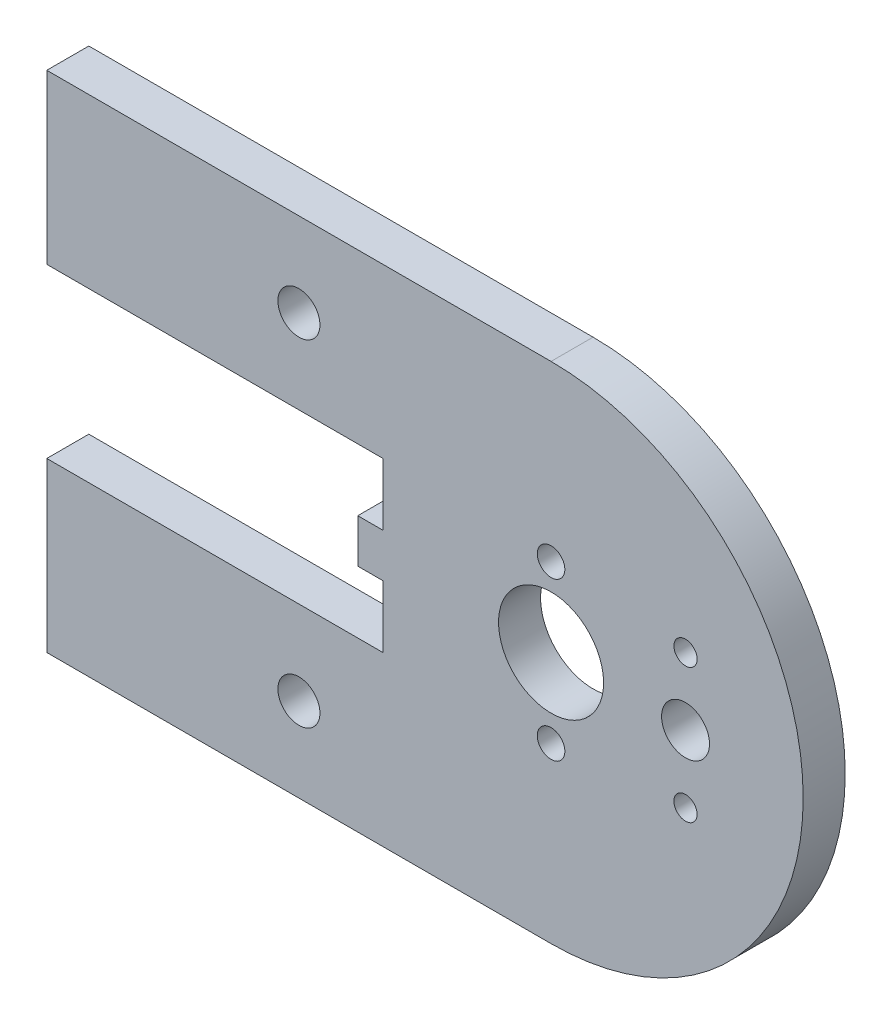
ISO-10303-21;
HEADER;
FILE_DESCRIPTION(('STEP AP214'),'2;1');
FILE_NAME('part.step','',(''),(''),'','','');
FILE_SCHEMA(('AUTOMOTIVE_DESIGN { 1 0 10303 214 1 1 1 1 }'));
ENDSEC;
DATA;
#1=APPLICATION_CONTEXT('core data for automotive mechanical design processes');
#2=APPLICATION_PROTOCOL_DEFINITION('international standard','automotive_design',2000,#1);
#3=PRODUCT_CONTEXT('',#1,'mechanical');
#4=PRODUCT('Part','Part','',(#3));
#5=PRODUCT_RELATED_PRODUCT_CATEGORY('part','',(#4));
#6=PRODUCT_DEFINITION_FORMATION('','',#4);
#7=PRODUCT_DEFINITION_CONTEXT('part definition',#1,'design');
#8=PRODUCT_DEFINITION('design','',#6,#7);
#9=PRODUCT_DEFINITION_SHAPE('','',#8);
#10=(LENGTH_UNIT() NAMED_UNIT(*) SI_UNIT(.MILLI.,.METRE.));
#11=(NAMED_UNIT(*) PLANE_ANGLE_UNIT() SI_UNIT($,.RADIAN.));
#12=(NAMED_UNIT(*) SI_UNIT($,.STERADIAN.) SOLID_ANGLE_UNIT());
#13=UNCERTAINTY_MEASURE_WITH_UNIT(LENGTH_MEASURE(1.E-05),#10,'distance_accuracy_value','');
#14=(GEOMETRIC_REPRESENTATION_CONTEXT(3) GLOBAL_UNCERTAINTY_ASSIGNED_CONTEXT((#13)) GLOBAL_UNIT_ASSIGNED_CONTEXT((#10,
#11,#12)) REPRESENTATION_CONTEXT('',''));
#15=CARTESIAN_POINT('',(0.,0.,0.));
#16=DIRECTION('',(0.,0.,1.));
#17=DIRECTION('',(1.,0.,0.));
#18=AXIS2_PLACEMENT_3D('',#15,#16,#17);
#19=CARTESIAN_POINT('',(12.7,12.7,0.));
#20=DIRECTION('',(1.,0.,0.));
#21=DIRECTION('',(0.,0.,-1.));
#22=AXIS2_PLACEMENT_3D('',#19,#20,#21);
#23=PLANE('',#22);
#24=DIRECTION('',(0.,0.,-1.));
#25=VECTOR('',#24,1.);
#26=CARTESIAN_POINT('',(12.7,3.302,0.));
#27=LINE('',#26,#25);
#28=CARTESIAN_POINT('',(12.7,3.302,6.35));
#29=VERTEX_POINT('',#28);
#30=CARTESIAN_POINT('',(12.7,3.302,0.));
#31=VERTEX_POINT('',#30);
#32=EDGE_CURVE('E332',#29,#31,#27,.T.);
#33=ORIENTED_EDGE('',*,*,#32,.F.);
#34=DIRECTION('',(0.,1.,0.));
#35=VECTOR('',#34,1.);
#36=CARTESIAN_POINT('',(12.7,12.7,6.35));
#37=LINE('',#36,#35);
#38=CARTESIAN_POINT('',(12.7,12.7,6.35));
#39=VERTEX_POINT('',#38);
#40=EDGE_CURVE('E174',#29,#39,#37,.T.);
#41=ORIENTED_EDGE('',*,*,#40,.T.);
#42=DIRECTION('',(0.,0.,1.));
#43=VECTOR('',#42,1.);
#44=CARTESIAN_POINT('',(12.7,12.7,0.));
#45=LINE('',#44,#43);
#46=CARTESIAN_POINT('',(12.7,12.7,0.));
#47=VERTEX_POINT('',#46);
#48=EDGE_CURVE('E234',#47,#39,#45,.T.);
#49=ORIENTED_EDGE('',*,*,#48,.F.);
#50=DIRECTION('',(0.,1.,0.));
#51=VECTOR('',#50,1.);
#52=CARTESIAN_POINT('',(12.7,12.7,0.));
#53=LINE('',#52,#51);
#54=EDGE_CURVE('E58',#31,#47,#53,.T.);
#55=ORIENTED_EDGE('',*,*,#54,.F.);
#56=EDGE_LOOP('',(#33,#41,#49,#55));
#57=FACE_BOUND('',#56,.T.);
#58=ADVANCED_FACE('F38',(#57),#23,.F.);
#59=DIRECTION('',(0.,0.,1.));
#60=VECTOR('',#59,1.);
#61=CARTESIAN_POINT('',(12.7,-3.302,0.));
#62=LINE('',#61,#60);
#63=CARTESIAN_POINT('',(12.7,-3.302,0.));
#64=VERTEX_POINT('',#63);
#65=CARTESIAN_POINT('',(12.7,-3.302,6.35));
#66=VERTEX_POINT('',#65);
#67=EDGE_CURVE('E69',#64,#66,#62,.T.);
#68=ORIENTED_EDGE('',*,*,#67,.F.);
#69=CARTESIAN_POINT('',(12.7,-12.7,0.));
#70=VERTEX_POINT('',#69);
#71=EDGE_CURVE('E223',#70,#64,#53,.T.);
#72=ORIENTED_EDGE('',*,*,#71,.F.);
#73=DIRECTION('',(0.,0.,1.));
#74=VECTOR('',#73,1.);
#75=CARTESIAN_POINT('',(12.7,-12.7,0.));
#76=LINE('',#75,#74);
#77=CARTESIAN_POINT('',(12.7,-12.7,6.35));
#78=VERTEX_POINT('',#77);
#79=EDGE_CURVE('E245',#70,#78,#76,.T.);
#80=ORIENTED_EDGE('',*,*,#79,.T.);
#81=EDGE_CURVE('E235',#78,#66,#37,.T.);
#82=ORIENTED_EDGE('',*,*,#81,.T.);
#83=EDGE_LOOP('',(#68,#72,#80,#82));
#84=FACE_BOUND('',#83,.T.);
#85=ADVANCED_FACE('F326',(#84),#23,.F.);
#86=CARTESIAN_POINT('',(38.1,0.,6.35));
#87=DIRECTION('',(0.,0.,-1.));
#88=DIRECTION('',(-1.,0.,0.));
#89=AXIS2_PLACEMENT_3D('',#86,#87,#88);
#90=PLANE('',#89);
#91=CARTESIAN_POINT('',(58.42,10.1599999999998,6.35));
#92=DIRECTION('',(0.,0.,-1.));
#93=DIRECTION('',(-1.,0.,0.));
#94=AXIS2_PLACEMENT_3D('',#91,#92,#93);
#95=CIRCLE('',#94,1.7526);
#96=CARTESIAN_POINT('',(56.6674,10.1599999999998,6.35));
#97=VERTEX_POINT('',#96);
#98=EDGE_CURVE('E360',#97,#97,#95,.T.);
#99=ORIENTED_EDGE('',*,*,#98,.T.);
#100=EDGE_LOOP('',(#99));
#101=FACE_BOUND('',#100,.T.);
#102=CARTESIAN_POINT('',(58.42,-10.1600000000002,6.35));
#103=DIRECTION('',(0.,0.,-1.));
#104=DIRECTION('',(-1.,0.,0.));
#105=AXIS2_PLACEMENT_3D('',#102,#103,#104);
#106=CIRCLE('',#105,1.7526);
#107=CARTESIAN_POINT('',(56.6674,-10.1600000000002,6.35));
#108=VERTEX_POINT('',#107);
#109=EDGE_CURVE('E349',#108,#108,#106,.T.);
#110=ORIENTED_EDGE('',*,*,#109,.T.);
#111=EDGE_LOOP('',(#110));
#112=FACE_BOUND('',#111,.T.);
#113=CARTESIAN_POINT('',(58.42,0.,6.35));
#114=DIRECTION('',(0.,0.,1.));
#115=DIRECTION('',(1.,0.,0.));
#116=AXIS2_PLACEMENT_3D('',#113,#114,#115);
#117=CIRCLE('',#116,3.6195);
#118=CARTESIAN_POINT('',(62.0395,0.,6.35));
#119=VERTEX_POINT('',#118);
#120=EDGE_CURVE('E336',#119,#119,#117,.T.);
#121=ORIENTED_EDGE('',*,*,#120,.F.);
#122=EDGE_LOOP('',(#121));
#123=FACE_BOUND('',#122,.T.);
#124=CARTESIAN_POINT('',(0.,-25.4,6.35));
#125=DIRECTION('',(0.,0.,1.));
#126=DIRECTION('',(1.,0.,0.));
#127=AXIS2_PLACEMENT_3D('',#124,#125,#126);
#128=CIRCLE('',#127,3.175);
#129=CARTESIAN_POINT('',(3.17500000000001,-25.4,6.35));
#130=VERTEX_POINT('',#129);
#131=EDGE_CURVE('E190',#130,#130,#128,.T.);
#132=ORIENTED_EDGE('',*,*,#131,.F.);
#133=EDGE_LOOP('',(#132));
#134=FACE_BOUND('',#133,.T.);
#135=CARTESIAN_POINT('',(38.1,-11.8999,6.35));
#136=DIRECTION('',(0.,0.,1.));
#137=DIRECTION('',(1.,0.,0.));
#138=AXIS2_PLACEMENT_3D('',#135,#136,#137);
#139=CIRCLE('',#138,2.0828);
#140=CARTESIAN_POINT('',(40.1828,-11.8999,6.35));
#141=VERTEX_POINT('',#140);
#142=EDGE_CURVE('E196',#141,#141,#139,.T.);
#143=ORIENTED_EDGE('',*,*,#142,.F.);
#144=EDGE_LOOP('',(#143));
#145=FACE_BOUND('',#144,.T.);
#146=CARTESIAN_POINT('',(38.1,11.8999,6.35));
#147=DIRECTION('',(0.,0.,1.));
#148=DIRECTION('',(1.,0.,0.));
#149=AXIS2_PLACEMENT_3D('',#146,#147,#148);
#150=CIRCLE('',#149,2.0828);
#151=CARTESIAN_POINT('',(40.1828,11.8999,6.35));
#152=VERTEX_POINT('',#151);
#153=EDGE_CURVE('E204',#152,#152,#150,.T.);
#154=ORIENTED_EDGE('',*,*,#153,.F.);
#155=EDGE_LOOP('',(#154));
#156=FACE_BOUND('',#155,.T.);
#157=CARTESIAN_POINT('',(38.1,0.,6.35));
#158=DIRECTION('',(0.,0.,1.));
#159=DIRECTION('',(1.,0.,0.));
#160=AXIS2_PLACEMENT_3D('',#157,#158,#159);
#161=CIRCLE('',#160,7.9375);
#162=CARTESIAN_POINT('',(46.0375,0.,6.35));
#163=VERTEX_POINT('',#162);
#164=EDGE_CURVE('E212',#163,#163,#161,.T.);
#165=ORIENTED_EDGE('',*,*,#164,.F.);
#166=EDGE_LOOP('',(#165));
#167=FACE_BOUND('',#166,.T.);
#168=ORIENTED_EDGE('',*,*,#81,.F.);
#169=DIRECTION('',(1.,0.,0.));
#170=VECTOR('',#169,1.);
#171=CARTESIAN_POINT('',(-38.1,-12.7,6.35));
#172=LINE('',#171,#170);
#173=CARTESIAN_POINT('',(-38.1,-12.7,6.35));
#174=VERTEX_POINT('',#173);
#175=EDGE_CURVE('E241',#174,#78,#172,.T.);
#176=ORIENTED_EDGE('',*,*,#175,.F.);
#177=DIRECTION('',(0.,1.,0.));
#178=VECTOR('',#177,1.);
#179=CARTESIAN_POINT('',(-38.1,-38.1,6.35));
#180=LINE('',#179,#178);
#181=CARTESIAN_POINT('',(-38.1,-38.1,6.35));
#182=VERTEX_POINT('',#181);
#183=EDGE_CURVE('E257',#182,#174,#180,.T.);
#184=ORIENTED_EDGE('',*,*,#183,.F.);
#185=DIRECTION('',(1.,0.,0.));
#186=VECTOR('',#185,1.);
#187=CARTESIAN_POINT('',(-38.1,-38.1,6.35));
#188=LINE('',#187,#186);
#189=CARTESIAN_POINT('',(38.1,-38.1,6.35));
#190=VERTEX_POINT('',#189);
#191=EDGE_CURVE('E269',#182,#190,#188,.T.);
#192=ORIENTED_EDGE('',*,*,#191,.T.);
#193=CARTESIAN_POINT('',(38.1,0.,6.35));
#194=DIRECTION('',(0.,0.,-1.));
#195=DIRECTION('',(-1.,0.,0.));
#196=AXIS2_PLACEMENT_3D('',#193,#194,#195);
#197=CIRCLE('',#196,38.1);
#198=CARTESIAN_POINT('',(38.1,38.1,6.35));
#199=VERTEX_POINT('',#198);
#200=EDGE_CURVE('E265',#199,#190,#197,.T.);
#201=ORIENTED_EDGE('',*,*,#200,.F.);
#202=DIRECTION('',(1.,0.,0.));
#203=VECTOR('',#202,1.);
#204=CARTESIAN_POINT('',(-38.1,38.1,6.35));
#205=LINE('',#204,#203);
#206=CARTESIAN_POINT('',(-38.1,38.1,6.35));
#207=VERTEX_POINT('',#206);
#208=EDGE_CURVE('E260',#207,#199,#205,.T.);
#209=ORIENTED_EDGE('',*,*,#208,.F.);
#210=CARTESIAN_POINT('',(-38.1,12.7,6.35));
#211=VERTEX_POINT('',#210);
#212=EDGE_CURVE('E261',#211,#207,#180,.T.);
#213=ORIENTED_EDGE('',*,*,#212,.F.);
#214=DIRECTION('',(-1.,0.,0.));
#215=VECTOR('',#214,1.);
#216=CARTESIAN_POINT('',(-38.1,12.7,6.35));
#217=LINE('',#216,#215);
#218=EDGE_CURVE('E238',#39,#211,#217,.T.);
#219=ORIENTED_EDGE('',*,*,#218,.F.);
#220=ORIENTED_EDGE('',*,*,#40,.F.);
#221=DIRECTION('',(1.,0.,0.));
#222=VECTOR('',#221,1.);
#223=CARTESIAN_POINT('',(8.89,3.302,6.35));
#224=LINE('',#223,#222);
#225=CARTESIAN_POINT('',(8.89,3.302,6.35));
#226=VERTEX_POINT('',#225);
#227=EDGE_CURVE('E151',#226,#29,#224,.T.);
#228=ORIENTED_EDGE('',*,*,#227,.F.);
#229=DIRECTION('',(0.,1.,0.));
#230=VECTOR('',#229,1.);
#231=CARTESIAN_POINT('',(8.89,3.302,6.35));
#232=LINE('',#231,#230);
#233=CARTESIAN_POINT('',(8.89,-3.302,6.35));
#234=VERTEX_POINT('',#233);
#235=EDGE_CURVE('E158',#234,#226,#232,.T.);
#236=ORIENTED_EDGE('',*,*,#235,.F.);
#237=DIRECTION('',(1.,0.,0.));
#238=VECTOR('',#237,1.);
#239=CARTESIAN_POINT('',(8.89,-3.302,6.35));
#240=LINE('',#239,#238);
#241=EDGE_CURVE('E325',#234,#66,#240,.T.);
#242=ORIENTED_EDGE('',*,*,#241,.T.);
#243=EDGE_LOOP('',(#168,#176,#184,#192,#201,#209,#213,#219,#220,#228,#236,#242));
#244=FACE_BOUND('',#243,.T.);
#245=CARTESIAN_POINT('',(0.,25.4,6.35));
#246=DIRECTION('',(0.,0.,-1.));
#247=DIRECTION('',(1.,0.,0.));
#248=AXIS2_PLACEMENT_3D('',#245,#246,#247);
#249=CIRCLE('',#248,3.175);
#250=CARTESIAN_POINT('',(3.17500000000001,25.4,6.35));
#251=VERTEX_POINT('',#250);
#252=EDGE_CURVE('E176',#251,#251,#249,.T.);
#253=ORIENTED_EDGE('',*,*,#252,.T.);
#254=EDGE_LOOP('',(#253));
#255=FACE_BOUND('',#254,.T.);
#256=ADVANCED_FACE('F171',(#101,#112,#123,#134,#145,#156,#167,#244,#255),#90,.F.);
#257=CARTESIAN_POINT('',(38.1,0.,0.));
#258=DIRECTION('',(0.,0.,-1.));
#259=DIRECTION('',(-1.,0.,0.));
#260=AXIS2_PLACEMENT_3D('',#257,#258,#259);
#261=PLANE('',#260);
#262=CARTESIAN_POINT('',(58.42,10.1599999999998,0.));
#263=DIRECTION('',(0.,0.,-1.));
#264=DIRECTION('',(-1.,0.,0.));
#265=AXIS2_PLACEMENT_3D('',#262,#263,#264);
#266=CIRCLE('',#265,1.7526);
#267=CARTESIAN_POINT('',(56.6674,10.1599999999998,0.));
#268=VERTEX_POINT('',#267);
#269=EDGE_CURVE('E364',#268,#268,#266,.T.);
#270=ORIENTED_EDGE('',*,*,#269,.F.);
#271=EDGE_LOOP('',(#270));
#272=FACE_BOUND('',#271,.T.);
#273=CARTESIAN_POINT('',(58.42,-10.1600000000002,0.));
#274=DIRECTION('',(0.,0.,-1.));
#275=DIRECTION('',(-1.,0.,0.));
#276=AXIS2_PLACEMENT_3D('',#273,#274,#275);
#277=CIRCLE('',#276,1.7526);
#278=CARTESIAN_POINT('',(56.6674,-10.1600000000002,0.));
#279=VERTEX_POINT('',#278);
#280=EDGE_CURVE('E356',#279,#279,#277,.T.);
#281=ORIENTED_EDGE('',*,*,#280,.F.);
#282=EDGE_LOOP('',(#281));
#283=FACE_BOUND('',#282,.T.);
#284=CARTESIAN_POINT('',(58.42,0.,0.));
#285=DIRECTION('',(0.,0.,-1.));
#286=DIRECTION('',(-1.,0.,0.));
#287=AXIS2_PLACEMENT_3D('',#284,#285,#286);
#288=CIRCLE('',#287,3.6195);
#289=CARTESIAN_POINT('',(54.8005,0.,0.));
#290=VERTEX_POINT('',#289);
#291=EDGE_CURVE('E345',#290,#290,#288,.F.);
#292=ORIENTED_EDGE('',*,*,#291,.T.);
#293=EDGE_LOOP('',(#292));
#294=FACE_BOUND('',#293,.T.);
#295=DIRECTION('',(1.,0.,0.));
#296=VECTOR('',#295,1.);
#297=CARTESIAN_POINT('',(-38.1,-12.7,0.));
#298=LINE('',#297,#296);
#299=CARTESIAN_POINT('',(-38.1,-12.7,0.));
#300=VERTEX_POINT('',#299);
#301=EDGE_CURVE('E230',#300,#70,#298,.T.);
#302=ORIENTED_EDGE('',*,*,#301,.T.);
#303=ORIENTED_EDGE('',*,*,#71,.T.);
#304=DIRECTION('',(1.,0.,0.));
#305=VECTOR('',#304,1.);
#306=CARTESIAN_POINT('',(8.89,-3.302,0.));
#307=LINE('',#306,#305);
#308=CARTESIAN_POINT('',(8.89,-3.302,0.));
#309=VERTEX_POINT('',#308);
#310=EDGE_CURVE('E184',#309,#64,#307,.T.);
#311=ORIENTED_EDGE('',*,*,#310,.F.);
#312=DIRECTION('',(0.,-1.,0.));
#313=VECTOR('',#312,1.);
#314=CARTESIAN_POINT('',(8.89,3.302,0.));
#315=LINE('',#314,#313);
#316=CARTESIAN_POINT('',(8.89,3.302,0.));
#317=VERTEX_POINT('',#316);
#318=EDGE_CURVE('E157',#317,#309,#315,.T.);
#319=ORIENTED_EDGE('',*,*,#318,.F.);
#320=DIRECTION('',(1.,0.,0.));
#321=VECTOR('',#320,1.);
#322=CARTESIAN_POINT('',(8.89,3.302,0.));
#323=LINE('',#322,#321);
#324=EDGE_CURVE('E153',#317,#31,#323,.T.);
#325=ORIENTED_EDGE('',*,*,#324,.T.);
#326=ORIENTED_EDGE('',*,*,#54,.T.);
#327=DIRECTION('',(-1.,0.,0.));
#328=VECTOR('',#327,1.);
#329=CARTESIAN_POINT('',(-38.1,12.7,0.));
#330=LINE('',#329,#328);
#331=CARTESIAN_POINT('',(-38.1,12.7,0.));
#332=VERTEX_POINT('',#331);
#333=EDGE_CURVE('E226',#47,#332,#330,.T.);
#334=ORIENTED_EDGE('',*,*,#333,.T.);
#335=DIRECTION('',(0.,1.,0.));
#336=VECTOR('',#335,1.);
#337=CARTESIAN_POINT('',(-38.1,-38.1,0.));
#338=LINE('',#337,#336);
#339=CARTESIAN_POINT('',(-38.1,38.1,0.));
#340=VERTEX_POINT('',#339);
#341=EDGE_CURVE('E248',#332,#340,#338,.T.);
#342=ORIENTED_EDGE('',*,*,#341,.T.);
#343=DIRECTION('',(1.,0.,0.));
#344=VECTOR('',#343,1.);
#345=CARTESIAN_POINT('',(-38.1,38.1,0.));
#346=LINE('',#345,#344);
#347=CARTESIAN_POINT('',(38.1,38.1,0.));
#348=VERTEX_POINT('',#347);
#349=EDGE_CURVE('E275',#340,#348,#346,.T.);
#350=ORIENTED_EDGE('',*,*,#349,.T.);
#351=CARTESIAN_POINT('',(38.1,0.,0.));
#352=DIRECTION('',(0.,0.,-1.));
#353=DIRECTION('',(-1.,0.,0.));
#354=AXIS2_PLACEMENT_3D('',#351,#352,#353);
#355=CIRCLE('',#354,38.1);
#356=CARTESIAN_POINT('',(38.1,-38.1,0.));
#357=VERTEX_POINT('',#356);
#358=EDGE_CURVE('E279',#348,#357,#355,.T.);
#359=ORIENTED_EDGE('',*,*,#358,.T.);
#360=DIRECTION('',(1.,0.,0.));
#361=VECTOR('',#360,1.);
#362=CARTESIAN_POINT('',(-38.1,-38.1,0.));
#363=LINE('',#362,#361);
#364=CARTESIAN_POINT('',(-38.1,-38.1,0.));
#365=VERTEX_POINT('',#364);
#366=EDGE_CURVE('E283',#365,#357,#363,.T.);
#367=ORIENTED_EDGE('',*,*,#366,.F.);
#368=EDGE_CURVE('E272',#365,#300,#338,.T.);
#369=ORIENTED_EDGE('',*,*,#368,.T.);
#370=EDGE_LOOP('',(#302,#303,#311,#319,#325,#326,#334,#342,#350,#359,#367,#369));
#371=FACE_BOUND('',#370,.T.);
#372=CARTESIAN_POINT('',(38.1,0.,0.));
#373=DIRECTION('',(0.,0.,1.));
#374=DIRECTION('',(1.,0.,0.));
#375=AXIS2_PLACEMENT_3D('',#372,#373,#374);
#376=CIRCLE('',#375,7.9375);
#377=CARTESIAN_POINT('',(46.0375,0.,0.));
#378=VERTEX_POINT('',#377);
#379=EDGE_CURVE('E216',#378,#378,#376,.T.);
#380=ORIENTED_EDGE('',*,*,#379,.T.);
#381=EDGE_LOOP('',(#380));
#382=FACE_BOUND('',#381,.T.);
#383=CARTESIAN_POINT('',(38.1,11.8999,0.));
#384=DIRECTION('',(0.,0.,1.));
#385=DIRECTION('',(1.,0.,0.));
#386=AXIS2_PLACEMENT_3D('',#383,#384,#385);
#387=CIRCLE('',#386,2.0828);
#388=CARTESIAN_POINT('',(40.1828,11.8999,0.));
#389=VERTEX_POINT('',#388);
#390=EDGE_CURVE('E208',#389,#389,#387,.T.);
#391=ORIENTED_EDGE('',*,*,#390,.T.);
#392=EDGE_LOOP('',(#391));
#393=FACE_BOUND('',#392,.T.);
#394=CARTESIAN_POINT('',(38.1,-11.8999,0.));
#395=DIRECTION('',(0.,0.,1.));
#396=DIRECTION('',(1.,0.,0.));
#397=AXIS2_PLACEMENT_3D('',#394,#395,#396);
#398=CIRCLE('',#397,2.0828);
#399=CARTESIAN_POINT('',(40.1828,-11.8999,0.));
#400=VERTEX_POINT('',#399);
#401=EDGE_CURVE('E200',#400,#400,#398,.T.);
#402=ORIENTED_EDGE('',*,*,#401,.T.);
#403=EDGE_LOOP('',(#402));
#404=FACE_BOUND('',#403,.T.);
#405=CARTESIAN_POINT('',(0.,-25.4,0.));
#406=DIRECTION('',(0.,0.,1.));
#407=DIRECTION('',(1.,0.,0.));
#408=AXIS2_PLACEMENT_3D('',#405,#406,#407);
#409=CIRCLE('',#408,3.175);
#410=CARTESIAN_POINT('',(3.17500000000001,-25.4,0.));
#411=VERTEX_POINT('',#410);
#412=EDGE_CURVE('E192',#411,#411,#409,.T.);
#413=ORIENTED_EDGE('',*,*,#412,.T.);
#414=EDGE_LOOP('',(#413));
#415=FACE_BOUND('',#414,.T.);
#416=CARTESIAN_POINT('',(0.,25.4,0.));
#417=DIRECTION('',(0.,0.,-1.));
#418=DIRECTION('',(1.,0.,0.));
#419=AXIS2_PLACEMENT_3D('',#416,#417,#418);
#420=CIRCLE('',#419,3.175);
#421=CARTESIAN_POINT('',(3.17500000000001,25.4,0.));
#422=VERTEX_POINT('',#421);
#423=EDGE_CURVE('E181',#422,#422,#420,.T.);
#424=ORIENTED_EDGE('',*,*,#423,.F.);
#425=EDGE_LOOP('',(#424));
#426=FACE_BOUND('',#425,.T.);
#427=ADVANCED_FACE('F303',(#272,#283,#294,#371,#382,#393,#404,#415,#426),#261,.T.);
#428=CARTESIAN_POINT('',(-38.1,-38.1,6.35));
#429=DIRECTION('',(-1.,0.,0.));
#430=DIRECTION('',(0.,0.,1.));
#431=AXIS2_PLACEMENT_3D('',#428,#429,#430);
#432=PLANE('',#431);
#433=DIRECTION('',(0.,0.,1.));
#434=VECTOR('',#433,1.);
#435=CARTESIAN_POINT('',(-38.1,-12.7,0.));
#436=LINE('',#435,#434);
#437=EDGE_CURVE('E249',#300,#174,#436,.T.);
#438=ORIENTED_EDGE('',*,*,#437,.F.);
#439=ORIENTED_EDGE('',*,*,#368,.F.);
#440=DIRECTION('',(0.,0.,-1.));
#441=VECTOR('',#440,1.);
#442=CARTESIAN_POINT('',(-38.1,-38.1,6.35));
#443=LINE('',#442,#441);
#444=EDGE_CURVE('E11',#182,#365,#443,.T.);
#445=ORIENTED_EDGE('',*,*,#444,.F.);
#446=ORIENTED_EDGE('',*,*,#183,.T.);
#447=EDGE_LOOP('',(#438,#439,#445,#446));
#448=FACE_BOUND('',#447,.T.);
#449=ADVANCED_FACE('F321',(#448),#432,.T.);
#450=DIRECTION('',(0.,0.,1.));
#451=VECTOR('',#450,1.);
#452=CARTESIAN_POINT('',(-38.1,12.7,0.));
#453=LINE('',#452,#451);
#454=EDGE_CURVE('E251',#332,#211,#453,.T.);
#455=ORIENTED_EDGE('',*,*,#454,.T.);
#456=ORIENTED_EDGE('',*,*,#212,.T.);
#457=DIRECTION('',(0.,0.,-1.));
#458=VECTOR('',#457,1.);
#459=CARTESIAN_POINT('',(-38.1,38.1,6.35));
#460=LINE('',#459,#458);
#461=EDGE_CURVE('E42',#207,#340,#460,.T.);
#462=ORIENTED_EDGE('',*,*,#461,.T.);
#463=ORIENTED_EDGE('',*,*,#341,.F.);
#464=EDGE_LOOP('',(#455,#456,#462,#463));
#465=FACE_BOUND('',#464,.T.);
#466=ADVANCED_FACE('F40',(#465),#432,.T.);
#467=CARTESIAN_POINT('',(-38.1,-38.1,6.35));
#468=DIRECTION('',(0.,1.,0.));
#469=DIRECTION('',(0.,0.,1.));
#470=AXIS2_PLACEMENT_3D('',#467,#468,#469);
#471=PLANE('',#470);
#472=ORIENTED_EDGE('',*,*,#366,.T.);
#473=DIRECTION('',(0.,0.,-1.));
#474=VECTOR('',#473,1.);
#475=CARTESIAN_POINT('',(38.1,-38.1,6.35));
#476=LINE('',#475,#474);
#477=EDGE_CURVE('E47',#190,#357,#476,.T.);
#478=ORIENTED_EDGE('',*,*,#477,.F.);
#479=ORIENTED_EDGE('',*,*,#191,.F.);
#480=ORIENTED_EDGE('',*,*,#444,.T.);
#481=EDGE_LOOP('',(#472,#478,#479,#480));
#482=FACE_BOUND('',#481,.T.);
#483=ADVANCED_FACE('F317',(#482),#471,.F.);
#484=CARTESIAN_POINT('',(38.1,0.,6.35));
#485=DIRECTION('',(0.,0.,-1.));
#486=DIRECTION('',(-1.,0.,0.));
#487=AXIS2_PLACEMENT_3D('',#484,#485,#486);
#488=CYLINDRICAL_SURFACE('',#487,38.1);
#489=ORIENTED_EDGE('',*,*,#358,.F.);
#490=DIRECTION('',(0.,0.,-1.));
#491=VECTOR('',#490,1.);
#492=CARTESIAN_POINT('',(38.1,38.1,6.35));
#493=LINE('',#492,#491);
#494=EDGE_CURVE('E288',#199,#348,#493,.T.);
#495=ORIENTED_EDGE('',*,*,#494,.F.);
#496=ORIENTED_EDGE('',*,*,#200,.T.);
#497=ORIENTED_EDGE('',*,*,#477,.T.);
#498=EDGE_LOOP('',(#489,#495,#496,#497));
#499=FACE_BOUND('',#498,.T.);
#500=ADVANCED_FACE('F315',(#499),#488,.T.);
#501=CARTESIAN_POINT('',(-38.1,38.1,6.35));
#502=DIRECTION('',(0.,1.,0.));
#503=DIRECTION('',(0.,0.,1.));
#504=AXIS2_PLACEMENT_3D('',#501,#502,#503);
#505=PLANE('',#504);
#506=ORIENTED_EDGE('',*,*,#349,.F.);
#507=ORIENTED_EDGE('',*,*,#461,.F.);
#508=ORIENTED_EDGE('',*,*,#208,.T.);
#509=ORIENTED_EDGE('',*,*,#494,.T.);
#510=EDGE_LOOP('',(#506,#507,#508,#509));
#511=FACE_BOUND('',#510,.T.);
#512=ADVANCED_FACE('F301',(#511),#505,.T.);
#513=CARTESIAN_POINT('',(-38.1,-12.7,0.));
#514=DIRECTION('',(0.,-1.,0.));
#515=DIRECTION('',(0.,0.,-1.));
#516=AXIS2_PLACEMENT_3D('',#513,#514,#515);
#517=PLANE('',#516);
#518=ORIENTED_EDGE('',*,*,#175,.T.);
#519=ORIENTED_EDGE('',*,*,#79,.F.);
#520=ORIENTED_EDGE('',*,*,#301,.F.);
#521=ORIENTED_EDGE('',*,*,#437,.T.);
#522=EDGE_LOOP('',(#518,#519,#520,#521));
#523=FACE_BOUND('',#522,.T.);
#524=ADVANCED_FACE('F324',(#523),#517,.F.);
#525=CARTESIAN_POINT('',(-38.1,12.7,0.));
#526=DIRECTION('',(0.,1.,0.));
#527=DIRECTION('',(0.,0.,1.));
#528=AXIS2_PLACEMENT_3D('',#525,#526,#527);
#529=PLANE('',#528);
#530=ORIENTED_EDGE('',*,*,#218,.T.);
#531=ORIENTED_EDGE('',*,*,#454,.F.);
#532=ORIENTED_EDGE('',*,*,#333,.F.);
#533=ORIENTED_EDGE('',*,*,#48,.T.);
#534=EDGE_LOOP('',(#530,#531,#532,#533));
#535=FACE_BOUND('',#534,.T.);
#536=ADVANCED_FACE('F309',(#535),#529,.F.);
#537=CARTESIAN_POINT('',(38.1,0.,0.));
#538=DIRECTION('',(0.,0.,1.));
#539=DIRECTION('',(1.,0.,0.));
#540=AXIS2_PLACEMENT_3D('',#537,#538,#539);
#541=CYLINDRICAL_SURFACE('',#540,7.9375);
#542=ORIENTED_EDGE('',*,*,#379,.F.);
#543=EDGE_LOOP('',(#542));
#544=FACE_BOUND('',#543,.T.);
#545=ORIENTED_EDGE('',*,*,#164,.T.);
#546=EDGE_LOOP('',(#545));
#547=FACE_BOUND('',#546,.T.);
#548=ADVANCED_FACE('F397',(#544,#547),#541,.F.);
#549=CARTESIAN_POINT('',(38.1,11.8999,0.));
#550=DIRECTION('',(0.,0.,1.));
#551=DIRECTION('',(1.,0.,0.));
#552=AXIS2_PLACEMENT_3D('',#549,#550,#551);
#553=CYLINDRICAL_SURFACE('',#552,2.0828);
#554=ORIENTED_EDGE('',*,*,#390,.F.);
#555=EDGE_LOOP('',(#554));
#556=FACE_BOUND('',#555,.T.);
#557=ORIENTED_EDGE('',*,*,#153,.T.);
#558=EDGE_LOOP('',(#557));
#559=FACE_BOUND('',#558,.T.);
#560=ADVANCED_FACE('F399',(#556,#559),#553,.F.);
#561=CARTESIAN_POINT('',(38.1,-11.8999,0.));
#562=DIRECTION('',(0.,0.,1.));
#563=DIRECTION('',(1.,0.,0.));
#564=AXIS2_PLACEMENT_3D('',#561,#562,#563);
#565=CYLINDRICAL_SURFACE('',#564,2.0828);
#566=ORIENTED_EDGE('',*,*,#401,.F.);
#567=EDGE_LOOP('',(#566));
#568=FACE_BOUND('',#567,.T.);
#569=ORIENTED_EDGE('',*,*,#142,.T.);
#570=EDGE_LOOP('',(#569));
#571=FACE_BOUND('',#570,.T.);
#572=ADVANCED_FACE('F406',(#568,#571),#565,.F.);
#573=CARTESIAN_POINT('',(0.,-25.4,0.));
#574=DIRECTION('',(0.,0.,1.));
#575=DIRECTION('',(1.,0.,0.));
#576=AXIS2_PLACEMENT_3D('',#573,#574,#575);
#577=CYLINDRICAL_SURFACE('',#576,3.175);
#578=ORIENTED_EDGE('',*,*,#412,.F.);
#579=EDGE_LOOP('',(#578));
#580=FACE_BOUND('',#579,.T.);
#581=ORIENTED_EDGE('',*,*,#131,.T.);
#582=EDGE_LOOP('',(#581));
#583=FACE_BOUND('',#582,.T.);
#584=ADVANCED_FACE('F453',(#580,#583),#577,.F.);
#585=CARTESIAN_POINT('',(0.,25.4,0.));
#586=DIRECTION('',(0.,0.,1.));
#587=DIRECTION('',(1.,0.,0.));
#588=AXIS2_PLACEMENT_3D('',#585,#586,#587);
#589=CYLINDRICAL_SURFACE('',#588,3.175);
#590=ORIENTED_EDGE('',*,*,#423,.T.);
#591=EDGE_LOOP('',(#590));
#592=FACE_BOUND('',#591,.T.);
#593=ORIENTED_EDGE('',*,*,#252,.F.);
#594=EDGE_LOOP('',(#593));
#595=FACE_BOUND('',#594,.T.);
#596=ADVANCED_FACE('F463',(#592,#595),#589,.F.);
#597=CARTESIAN_POINT('',(8.89,3.302,0.));
#598=DIRECTION('',(0.,-1.,0.));
#599=DIRECTION('',(0.,0.,-1.));
#600=AXIS2_PLACEMENT_3D('',#597,#598,#599);
#601=PLANE('',#600);
#602=ORIENTED_EDGE('',*,*,#32,.T.);
#603=ORIENTED_EDGE('',*,*,#324,.F.);
#604=DIRECTION('',(0.,0.,-1.));
#605=VECTOR('',#604,1.);
#606=CARTESIAN_POINT('',(8.89,3.302,0.));
#607=LINE('',#606,#605);
#608=EDGE_CURVE('E147',#226,#317,#607,.T.);
#609=ORIENTED_EDGE('',*,*,#608,.F.);
#610=ORIENTED_EDGE('',*,*,#227,.T.);
#611=EDGE_LOOP('',(#602,#603,#609,#610));
#612=FACE_BOUND('',#611,.T.);
#613=ADVANCED_FACE('F149',(#612),#601,.F.);
#614=CARTESIAN_POINT('',(8.89,-3.302,0.));
#615=DIRECTION('',(0.,1.,0.));
#616=DIRECTION('',(0.,0.,1.));
#617=AXIS2_PLACEMENT_3D('',#614,#615,#616);
#618=PLANE('',#617);
#619=ORIENTED_EDGE('',*,*,#67,.T.);
#620=ORIENTED_EDGE('',*,*,#241,.F.);
#621=DIRECTION('',(0.,0.,1.));
#622=VECTOR('',#621,1.);
#623=CARTESIAN_POINT('',(8.89,-3.302,0.));
#624=LINE('',#623,#622);
#625=EDGE_CURVE('E163',#309,#234,#624,.T.);
#626=ORIENTED_EDGE('',*,*,#625,.F.);
#627=ORIENTED_EDGE('',*,*,#310,.T.);
#628=EDGE_LOOP('',(#619,#620,#626,#627));
#629=FACE_BOUND('',#628,.T.);
#630=ADVANCED_FACE('F329',(#629),#618,.F.);
#631=CARTESIAN_POINT('',(8.89,0.,0.));
#632=DIRECTION('',(-1.,0.,0.));
#633=DIRECTION('',(0.,0.,1.));
#634=AXIS2_PLACEMENT_3D('',#631,#632,#633);
#635=PLANE('',#634);
#636=ORIENTED_EDGE('',*,*,#235,.T.);
#637=ORIENTED_EDGE('',*,*,#608,.T.);
#638=ORIENTED_EDGE('',*,*,#318,.T.);
#639=ORIENTED_EDGE('',*,*,#625,.T.);
#640=EDGE_LOOP('',(#636,#637,#638,#639));
#641=FACE_BOUND('',#640,.T.);
#642=ADVANCED_FACE('F161',(#641),#635,.T.);
#643=CARTESIAN_POINT('',(58.42,0.,-0.00100000000000013));
#644=DIRECTION('',(0.,0.,1.));
#645=DIRECTION('',(1.,0.,0.));
#646=AXIS2_PLACEMENT_3D('',#643,#644,#645);
#647=CYLINDRICAL_SURFACE('',#646,3.6195);
#648=ORIENTED_EDGE('',*,*,#291,.F.);
#649=EDGE_LOOP('',(#648));
#650=FACE_BOUND('',#649,.T.);
#651=ORIENTED_EDGE('',*,*,#120,.T.);
#652=EDGE_LOOP('',(#651));
#653=FACE_BOUND('',#652,.T.);
#654=ADVANCED_FACE('F378',(#650,#653),#647,.F.);
#655=CARTESIAN_POINT('',(58.42,-10.1600000000002,0.));
#656=DIRECTION('',(0.,0.,-1.));
#657=DIRECTION('',(-1.,0.,0.));
#658=AXIS2_PLACEMENT_3D('',#655,#656,#657);
#659=CYLINDRICAL_SURFACE('',#658,1.7526);
#660=ORIENTED_EDGE('',*,*,#109,.F.);
#661=EDGE_LOOP('',(#660));
#662=FACE_BOUND('',#661,.T.);
#663=ORIENTED_EDGE('',*,*,#280,.T.);
#664=EDGE_LOOP('',(#663));
#665=FACE_BOUND('',#664,.T.);
#666=ADVANCED_FACE('F381',(#662,#665),#659,.F.);
#667=CARTESIAN_POINT('',(58.42,10.1599999999998,0.));
#668=DIRECTION('',(0.,0.,-1.));
#669=DIRECTION('',(-1.,0.,0.));
#670=AXIS2_PLACEMENT_3D('',#667,#668,#669);
#671=CYLINDRICAL_SURFACE('',#670,1.7526);
#672=ORIENTED_EDGE('',*,*,#98,.F.);
#673=EDGE_LOOP('',(#672));
#674=FACE_BOUND('',#673,.T.);
#675=ORIENTED_EDGE('',*,*,#269,.T.);
#676=EDGE_LOOP('',(#675));
#677=FACE_BOUND('',#676,.T.);
#678=ADVANCED_FACE('F369',(#674,#677),#671,.F.);
#679=CLOSED_SHELL('',(#58,#85,#256,#427,#449,#466,#483,#500,#512,#524,#536,#548,#560,#572,#584,
#596,#613,#630,#642,#654,#666,#678));
#680=MANIFOLD_SOLID_BREP('B2',#679);
#681=ADVANCED_BREP_SHAPE_REPRESENTATION('',(#18,#680),#14);
#682=SHAPE_DEFINITION_REPRESENTATION(#9,#681);
ENDSEC;
END-ISO-10303-21;
